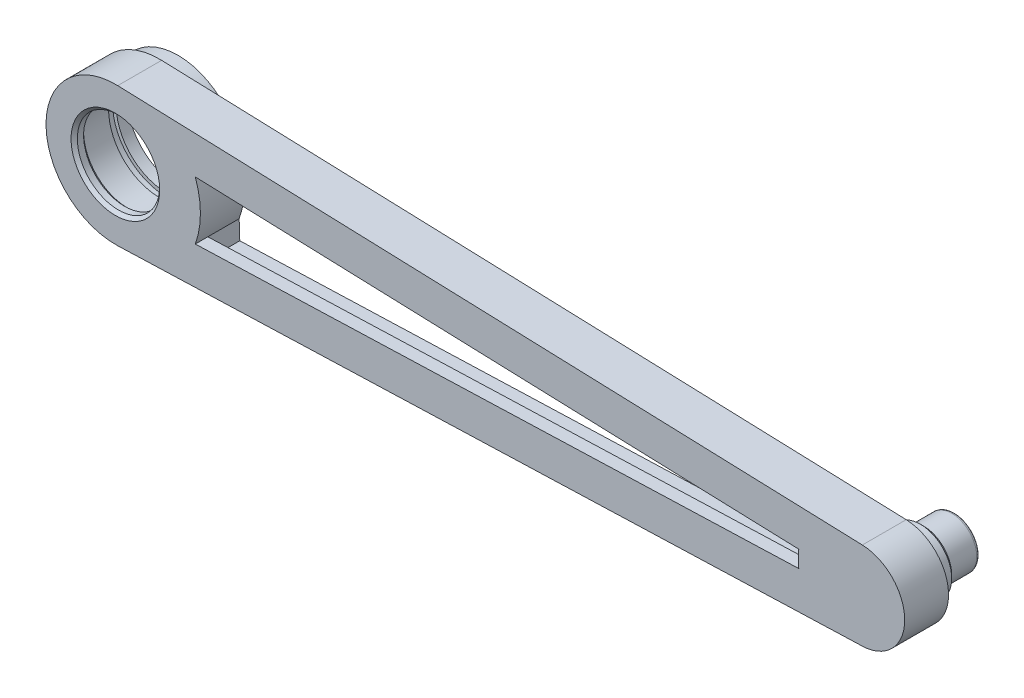
ISO-10303-21;
HEADER;
FILE_DESCRIPTION(('STEP AP214'),'2;1');
FILE_NAME('part.step','',(''),(''),'','','');
FILE_SCHEMA(('AUTOMOTIVE_DESIGN { 1 0 10303 214 1 1 1 1 }'));
ENDSEC;
DATA;
#1=APPLICATION_CONTEXT('core data for automotive mechanical design processes');
#2=APPLICATION_PROTOCOL_DEFINITION('international standard','automotive_design',2000,#1);
#3=PRODUCT_CONTEXT('',#1,'mechanical');
#4=PRODUCT('Part','Part','',(#3));
#5=PRODUCT_RELATED_PRODUCT_CATEGORY('part','',(#4));
#6=PRODUCT_DEFINITION_FORMATION('','',#4);
#7=PRODUCT_DEFINITION_CONTEXT('part definition',#1,'design');
#8=PRODUCT_DEFINITION('design','',#6,#7);
#9=PRODUCT_DEFINITION_SHAPE('','',#8);
#10=(LENGTH_UNIT() NAMED_UNIT(*) SI_UNIT(.MILLI.,.METRE.));
#11=(NAMED_UNIT(*) PLANE_ANGLE_UNIT() SI_UNIT($,.RADIAN.));
#12=(NAMED_UNIT(*) SI_UNIT($,.STERADIAN.) SOLID_ANGLE_UNIT());
#13=UNCERTAINTY_MEASURE_WITH_UNIT(LENGTH_MEASURE(1.E-05),#10,'distance_accuracy_value','');
#14=(GEOMETRIC_REPRESENTATION_CONTEXT(3) GLOBAL_UNCERTAINTY_ASSIGNED_CONTEXT((#13)) GLOBAL_UNIT_ASSIGNED_CONTEXT((#10,
#11,#12)) REPRESENTATION_CONTEXT('',''));
#15=CARTESIAN_POINT('',(0.,0.,0.));
#16=DIRECTION('',(0.,0.,1.));
#17=DIRECTION('',(1.,0.,0.));
#18=AXIS2_PLACEMENT_3D('',#15,#16,#17);
#19=CARTESIAN_POINT('',(0.,0.,7.));
#20=DIRECTION('',(0.,0.,-1.));
#21=DIRECTION('',(-1.,0.,0.));
#22=AXIS2_PLACEMENT_3D('',#19,#20,#21);
#23=CYLINDRICAL_SURFACE('',#22,8.075);
#24=CARTESIAN_POINT('',(0.,0.,-3.));
#25=DIRECTION('',(0.,0.,-1.));
#26=DIRECTION('',(-1.,0.,0.));
#27=AXIS2_PLACEMENT_3D('',#24,#25,#26);
#28=CIRCLE('',#27,8.075);
#29=CARTESIAN_POINT('',(-8.075,0.,-3.));
#30=VERTEX_POINT('',#29);
#31=EDGE_CURVE('E315',#30,#30,#28,.T.);
#32=ORIENTED_EDGE('',*,*,#31,.T.);
#33=EDGE_LOOP('',(#32));
#34=FACE_BOUND('',#33,.T.);
#35=CARTESIAN_POINT('',(0.,0.,-1.2));
#36=DIRECTION('',(0.,0.,1.));
#37=DIRECTION('',(1.,0.,0.));
#38=AXIS2_PLACEMENT_3D('',#35,#36,#37);
#39=CIRCLE('',#38,8.075);
#40=CARTESIAN_POINT('',(8.075,0.,-1.2));
#41=VERTEX_POINT('',#40);
#42=EDGE_CURVE('E51',#41,#41,#39,.T.);
#43=ORIENTED_EDGE('',*,*,#42,.T.);
#44=EDGE_LOOP('',(#43));
#45=FACE_BOUND('',#44,.T.);
#46=ADVANCED_FACE('F50',(#34,#45),#23,.F.);
#47=CARTESIAN_POINT('',(0.,0.,0.));
#48=DIRECTION('',(0.,0.,1.));
#49=DIRECTION('',(1.,0.,0.));
#50=AXIS2_PLACEMENT_3D('',#47,#48,#49);
#51=PLANE('',#50);
#52=DIRECTION('',(0.0342782664469188,-0.99941232754524,0.));
#53=VECTOR('',#52,1.);
#54=CARTESIAN_POINT('',(109.089697810009,-1.33637962534958,0.));
#55=LINE('',#54,#53);
#56=CARTESIAN_POINT('',(109.089697810009,-1.33637962534958,0.));
#57=VERTEX_POINT('',#56);
#58=CARTESIAN_POINT('',(109.192532609349,-4.3346166079853,0.));
#59=VERTEX_POINT('',#58);
#60=EDGE_CURVE('E64',#57,#59,#55,.T.);
#61=ORIENTED_EDGE('',*,*,#60,.F.);
#62=CARTESIAN_POINT('',(119.,0.,0.));
#63=DIRECTION('',(0.,0.,-1.));
#64=DIRECTION('',(-1.,0.,0.));
#65=AXIS2_PLACEMENT_3D('',#62,#63,#64);
#66=CIRCLE('',#65,9.99999999999997);
#67=CARTESIAN_POINT('',(109.090204802286,1.34013400052452,0.));
#68=VERTEX_POINT('',#67);
#69=EDGE_CURVE('E220',#57,#68,#66,.T.);
#70=ORIENTED_EDGE('',*,*,#69,.T.);
#71=DIRECTION('',(-0.0342436974789945,-0.999413512607753,0.));
#72=VECTOR('',#71,1.);
#73=CARTESIAN_POINT('',(109.192935894723,4.33837453834778,0.));
#74=LINE('',#73,#72);
#75=CARTESIAN_POINT('',(109.192935894723,4.33837453834778,0.));
#76=VERTEX_POINT('',#75);
#77=EDGE_CURVE('E199',#76,#68,#74,.T.);
#78=ORIENTED_EDGE('',*,*,#77,.F.);
#79=DIRECTION('',(0.999413512607753,-0.0342436974789916,0.));
#80=VECTOR('',#79,1.);
#81=CARTESIAN_POINT('',(12.8598047369581,7.63911298039967,0.));
#82=LINE('',#81,#80);
#83=CARTESIAN_POINT('',(12.8598047369581,7.63911298039967,0.));
#84=VERTEX_POINT('',#83);
#85=EDGE_CURVE('E201',#84,#76,#82,.T.);
#86=ORIENTED_EDGE('',*,*,#85,.F.);
#87=DIRECTION('',(0.0342436974789916,0.999413512607753,0.));
#88=VECTOR('',#87,1.);
#89=CARTESIAN_POINT('',(12.8598047369581,7.63911298039967,0.));
#90=LINE('',#89,#88);
#91=CARTESIAN_POINT('',(12.7570736445211,4.64087244257641,0.));
#92=VERTEX_POINT('',#91);
#93=EDGE_CURVE('E71',#92,#84,#90,.T.);
#94=ORIENTED_EDGE('',*,*,#93,.F.);
#95=CARTESIAN_POINT('',(0.,0.,0.));
#96=DIRECTION('',(0.,0.,-1.));
#97=DIRECTION('',(-1.,0.,0.));
#98=AXIS2_PLACEMENT_3D('',#95,#96,#97);
#99=CIRCLE('',#98,13.575);
#100=CARTESIAN_POINT('',(12.7572341613009,-4.64043118187699,0.));
#101=VERTEX_POINT('',#100);
#102=EDGE_CURVE('E221',#92,#101,#99,.T.);
#103=ORIENTED_EDGE('',*,*,#102,.T.);
#104=DIRECTION('',(-0.0342782664469217,0.99941232754524,0.));
#105=VECTOR('',#104,1.);
#106=CARTESIAN_POINT('',(12.7572341613009,-4.64043118187699,0.));
#107=LINE('',#106,#105);
#108=CARTESIAN_POINT('',(12.8600689606417,-7.63866816451271,0.));
#109=VERTEX_POINT('',#108);
#110=EDGE_CURVE('E167',#109,#101,#107,.T.);
#111=ORIENTED_EDGE('',*,*,#110,.F.);
#112=DIRECTION('',(-0.99941232754524,-0.034278266446919,0.));
#113=VECTOR('',#112,1.);
#114=CARTESIAN_POINT('',(109.192532609349,-4.3346166079853,0.));
#115=LINE('',#114,#113);
#116=EDGE_CURVE('E175',#59,#109,#115,.T.);
#117=ORIENTED_EDGE('',*,*,#116,.F.);
#118=EDGE_LOOP('',(#61,#70,#78,#86,#94,#103,#111,#117));
#119=FACE_BOUND('',#118,.T.);
#120=DIRECTION('',(0.99941232754524,0.0342782664469186,0.));
#121=VECTOR('',#120,1.);
#122=CARTESIAN_POINT('',(0.379631800899624,-11.0684915275635,0.));
#123=LINE('',#122,#121);
#124=CARTESIAN_POINT('',(0.379631800899624,-11.0684915275635,0.));
#125=VERTEX_POINT('',#124);
#126=CARTESIAN_POINT('',(119.,-7.00000000000001,0.));
#127=VERTEX_POINT('',#126);
#128=EDGE_CURVE('E249',#125,#127,#123,.T.);
#129=ORIENTED_EDGE('',*,*,#128,.F.);
#130=CARTESIAN_POINT('',(0.,0.,0.));
#131=DIRECTION('',(0.,0.,1.));
#132=DIRECTION('',(1.,0.,0.));
#133=AXIS2_PLACEMENT_3D('',#130,#131,#132);
#134=CIRCLE('',#133,11.075);
#135=CARTESIAN_POINT('',(0.379248949579832,11.0685046521309,0.));
#136=VERTEX_POINT('',#135);
#137=EDGE_CURVE('E253',#136,#125,#134,.T.);
#138=ORIENTED_EDGE('',*,*,#137,.F.);
#139=DIRECTION('',(0.999413512607753,-0.0342436974789916,0.));
#140=VECTOR('',#139,1.);
#141=CARTESIAN_POINT('',(0.379248949579832,11.0685046521309,0.));
#142=LINE('',#141,#140);
#143=CARTESIAN_POINT('',(119.239705882353,6.99589458825428,0.));
#144=VERTEX_POINT('',#143);
#145=EDGE_CURVE('E270',#136,#144,#142,.T.);
#146=ORIENTED_EDGE('',*,*,#145,.T.);
#147=CARTESIAN_POINT('',(119.,0.,0.));
#148=DIRECTION('',(0.,0.,1.));
#149=DIRECTION('',(1.,0.,0.));
#150=AXIS2_PLACEMENT_3D('',#147,#148,#149);
#151=CIRCLE('',#150,7.00000000000001);
#152=EDGE_CURVE('E264',#127,#144,#151,.T.);
#153=ORIENTED_EDGE('',*,*,#152,.F.);
#154=EDGE_LOOP('',(#129,#138,#146,#153));
#155=FACE_BOUND('',#154,.T.);
#156=CARTESIAN_POINT('',(119.,0.,0.));
#157=DIRECTION('',(0.,0.,1.));
#158=DIRECTION('',(1.,0.,0.));
#159=AXIS2_PLACEMENT_3D('',#156,#157,#158);
#160=CIRCLE('',#159,5.);
#161=CARTESIAN_POINT('',(124.,0.,0.));
#162=VERTEX_POINT('',#161);
#163=EDGE_CURVE('E283',#162,#162,#160,.F.);
#164=ORIENTED_EDGE('',*,*,#163,.F.);
#165=EDGE_LOOP('',(#164));
#166=FACE_BOUND('',#165,.T.);
#167=CARTESIAN_POINT('',(0.,0.,0.));
#168=DIRECTION('',(0.,0.,1.));
#169=DIRECTION('',(1.,0.,0.));
#170=AXIS2_PLACEMENT_3D('',#167,#168,#169);
#171=CIRCLE('',#170,10.075);
#172=CARTESIAN_POINT('',(10.075,0.,0.));
#173=VERTEX_POINT('',#172);
#174=EDGE_CURVE('E11',#173,#173,#171,.F.);
#175=ORIENTED_EDGE('',*,*,#174,.F.);
#176=EDGE_LOOP('',(#175));
#177=FACE_BOUND('',#176,.T.);
#178=ADVANCED_FACE('F349',(#119,#155,#166,#177),#51,.F.);
#179=CARTESIAN_POINT('',(119.,0.,-10.));
#180=DIRECTION('',(0.,0.,1.));
#181=DIRECTION('',(1.,0.,0.));
#182=AXIS2_PLACEMENT_3D('',#179,#180,#181);
#183=CYLINDRICAL_SURFACE('',#182,4.00000000000001);
#184=CARTESIAN_POINT('',(119.,0.,-7.5));
#185=DIRECTION('',(0.,0.,-1.));
#186=DIRECTION('',(-1.,0.,0.));
#187=AXIS2_PLACEMENT_3D('',#184,#185,#186);
#188=CIRCLE('',#187,4.00000000000001);
#189=CARTESIAN_POINT('',(115.,0.,-7.5));
#190=VERTEX_POINT('',#189);
#191=EDGE_CURVE('E57',#190,#190,#188,.F.);
#192=ORIENTED_EDGE('',*,*,#191,.T.);
#193=EDGE_LOOP('',(#192));
#194=FACE_BOUND('',#193,.T.);
#195=CARTESIAN_POINT('',(119.,0.,-3.));
#196=DIRECTION('',(0.,0.,-1.));
#197=DIRECTION('',(-1.,0.,0.));
#198=AXIS2_PLACEMENT_3D('',#195,#196,#197);
#199=CIRCLE('',#198,4.00000000000001);
#200=CARTESIAN_POINT('',(115.,0.,-3.));
#201=VERTEX_POINT('',#200);
#202=EDGE_CURVE('E222',#201,#201,#199,.T.);
#203=ORIENTED_EDGE('',*,*,#202,.T.);
#204=EDGE_LOOP('',(#203));
#205=FACE_BOUND('',#204,.T.);
#206=ADVANCED_FACE('F360',(#194,#205),#183,.T.);
#207=CARTESIAN_POINT('',(0.173786764705882,5.07202357648435,103.779206215118));
#208=DIRECTION('',(0.0342436974789916,0.999413512607753,0.));
#209=DIRECTION('',(-0.999413512607753,0.0342436974789916,0.));
#210=AXIS2_PLACEMENT_3D('',#207,#208,#209);
#211=PLANE('',#210);
#212=DIRECTION('',(-0.999413512607753,0.0342436974789916,0.));
#213=VECTOR('',#212,1.);
#214=CARTESIAN_POINT('',(12.7570736445211,4.64087244257641,5.));
#215=LINE('',#214,#213);
#216=CARTESIAN_POINT('',(109.090204802286,1.34013400052452,5.));
#217=VERTEX_POINT('',#216);
#218=CARTESIAN_POINT('',(12.7570736445211,4.64087244257641,5.));
#219=VERTEX_POINT('',#218);
#220=EDGE_CURVE('E193',#217,#219,#215,.T.);
#221=ORIENTED_EDGE('',*,*,#220,.F.);
#222=DIRECTION('',(0.,0.,-1.));
#223=VECTOR('',#222,1.);
#224=CARTESIAN_POINT('',(109.090204802286,1.34013400052452,103.779206215118));
#225=LINE('',#224,#223);
#226=CARTESIAN_POINT('',(109.090204802286,1.34013400052452,7.00000000000001));
#227=VERTEX_POINT('',#226);
#228=EDGE_CURVE('E229',#227,#217,#225,.T.);
#229=ORIENTED_EDGE('',*,*,#228,.F.);
#230=DIRECTION('',(0.999413512607753,-0.0342436974789916,0.));
#231=VECTOR('',#230,1.);
#232=CARTESIAN_POINT('',(0.173786764705882,5.07202357648435,7.00000000000001));
#233=LINE('',#232,#231);
#234=CARTESIAN_POINT('',(12.7570736445211,4.64087244257641,7.00000000000001));
#235=VERTEX_POINT('',#234);
#236=EDGE_CURVE('E227',#235,#227,#233,.T.);
#237=ORIENTED_EDGE('',*,*,#236,.F.);
#238=DIRECTION('',(0.,0.,-1.));
#239=VECTOR('',#238,1.);
#240=CARTESIAN_POINT('',(12.7570736445211,4.64087244257641,103.779206215118));
#241=LINE('',#240,#239);
#242=EDGE_CURVE('E228',#235,#219,#241,.T.);
#243=ORIENTED_EDGE('',*,*,#242,.T.);
#244=EDGE_LOOP('',(#221,#229,#237,#243));
#245=FACE_BOUND('',#244,.T.);
#246=ADVANCED_FACE('F374',(#245),#211,.F.);
#247=CARTESIAN_POINT('',(0.173962202218114,-5.07201756229209,103.779206215118));
#248=DIRECTION('',(0.034278266446919,-0.99941232754524,0.));
#249=DIRECTION('',(0.99941232754524,0.034278266446919,0.));
#250=AXIS2_PLACEMENT_3D('',#247,#248,#249);
#251=PLANE('',#250);
#252=DIRECTION('',(0.99941232754524,0.034278266446919,0.));
#253=VECTOR('',#252,1.);
#254=CARTESIAN_POINT('',(109.089697810009,-1.33637962534958,5.));
#255=LINE('',#254,#253);
#256=CARTESIAN_POINT('',(12.7572341613009,-4.64043118187699,5.));
#257=VERTEX_POINT('',#256);
#258=CARTESIAN_POINT('',(109.089697810009,-1.33637962534958,5.));
#259=VERTEX_POINT('',#258);
#260=EDGE_CURVE('E156',#257,#259,#255,.T.);
#261=ORIENTED_EDGE('',*,*,#260,.F.);
#262=DIRECTION('',(0.,0.,-1.));
#263=VECTOR('',#262,1.);
#264=CARTESIAN_POINT('',(12.7572341613009,-4.64043118187699,103.779206215118));
#265=LINE('',#264,#263);
#266=CARTESIAN_POINT('',(12.7572341613009,-4.64043118187699,7.00000000000001));
#267=VERTEX_POINT('',#266);
#268=EDGE_CURVE('E232',#267,#257,#265,.T.);
#269=ORIENTED_EDGE('',*,*,#268,.F.);
#270=DIRECTION('',(-0.99941232754524,-0.034278266446919,0.));
#271=VECTOR('',#270,1.);
#272=CARTESIAN_POINT('',(0.173962202218114,-5.07201756229209,7.00000000000001));
#273=LINE('',#272,#271);
#274=CARTESIAN_POINT('',(109.089697810009,-1.33637962534958,7.00000000000001));
#275=VERTEX_POINT('',#274);
#276=EDGE_CURVE('E219',#275,#267,#273,.T.);
#277=ORIENTED_EDGE('',*,*,#276,.F.);
#278=DIRECTION('',(0.,0.,-1.));
#279=VECTOR('',#278,1.);
#280=CARTESIAN_POINT('',(109.089697810009,-1.33637962534958,103.779206215118));
#281=LINE('',#280,#279);
#282=EDGE_CURVE('E224',#275,#259,#281,.T.);
#283=ORIENTED_EDGE('',*,*,#282,.T.);
#284=EDGE_LOOP('',(#261,#269,#277,#283));
#285=FACE_BOUND('',#284,.T.);
#286=ADVANCED_FACE('F362',(#285),#251,.F.);
#287=CARTESIAN_POINT('',(0.,0.,0.));
#288=DIRECTION('',(0.,0.,1.));
#289=DIRECTION('',(1.,0.,0.));
#290=AXIS2_PLACEMENT_3D('',#287,#288,#289);
#291=CIRCLE('',#290,8.075);
#292=CARTESIAN_POINT('',(8.075,0.,0.));
#293=VERTEX_POINT('',#292);
#294=EDGE_CURVE('E306',#293,#293,#291,.T.);
#295=ORIENTED_EDGE('',*,*,#294,.F.);
#296=EDGE_LOOP('',(#295));
#297=FACE_BOUND('',#296,.T.);
#298=CARTESIAN_POINT('',(0.,0.,5.));
#299=DIRECTION('',(0.,0.,1.));
#300=DIRECTION('',(1.,0.,0.));
#301=AXIS2_PLACEMENT_3D('',#298,#299,#300);
#302=CIRCLE('',#301,8.075);
#303=CARTESIAN_POINT('',(8.075,0.,5.));
#304=VERTEX_POINT('',#303);
#305=EDGE_CURVE('E250',#304,#304,#302,.T.);
#306=ORIENTED_EDGE('',*,*,#305,.T.);
#307=EDGE_LOOP('',(#306));
#308=FACE_BOUND('',#307,.T.);
#309=ADVANCED_FACE('F355',(#297,#308),#23,.F.);
#310=CARTESIAN_POINT('',(0.379631800899624,-11.0684915275635,7.));
#311=DIRECTION('',(-0.0342782664469186,0.99941232754524,0.));
#312=DIRECTION('',(-0.99941232754524,-0.0342782664469186,0.));
#313=AXIS2_PLACEMENT_3D('',#310,#311,#312);
#314=PLANE('',#313);
#315=ORIENTED_EDGE('',*,*,#128,.T.);
#316=DIRECTION('',(0.,0.,-1.));
#317=VECTOR('',#316,1.);
#318=CARTESIAN_POINT('',(119.,-7.00000000000001,7.));
#319=LINE('',#318,#317);
#320=CARTESIAN_POINT('',(119.,-7.00000000000001,7.));
#321=VERTEX_POINT('',#320);
#322=EDGE_CURVE('E276',#321,#127,#319,.T.);
#323=ORIENTED_EDGE('',*,*,#322,.F.);
#324=DIRECTION('',(0.99941232754524,0.0342782664469186,0.));
#325=VECTOR('',#324,1.);
#326=CARTESIAN_POINT('',(0.379631800899624,-11.0684915275635,7.));
#327=LINE('',#326,#325);
#328=CARTESIAN_POINT('',(0.379631800899624,-11.0684915275635,7.));
#329=VERTEX_POINT('',#328);
#330=EDGE_CURVE('E252',#329,#321,#327,.T.);
#331=ORIENTED_EDGE('',*,*,#330,.F.);
#332=DIRECTION('',(0.,0.,-1.));
#333=VECTOR('',#332,1.);
#334=CARTESIAN_POINT('',(0.379631800899624,-11.0684915275635,7.));
#335=LINE('',#334,#333);
#336=EDGE_CURVE('E265',#329,#125,#335,.T.);
#337=ORIENTED_EDGE('',*,*,#336,.T.);
#338=EDGE_LOOP('',(#315,#323,#331,#337));
#339=FACE_BOUND('',#338,.T.);
#340=ADVANCED_FACE('F364',(#339),#314,.F.);
#341=CARTESIAN_POINT('',(119.,0.,7.));
#342=DIRECTION('',(0.,0.,-1.));
#343=DIRECTION('',(-1.,0.,0.));
#344=AXIS2_PLACEMENT_3D('',#341,#342,#343);
#345=CYLINDRICAL_SURFACE('',#344,7.00000000000001);
#346=ORIENTED_EDGE('',*,*,#152,.T.);
#347=DIRECTION('',(0.,0.,-1.));
#348=VECTOR('',#347,1.);
#349=CARTESIAN_POINT('',(119.239705882353,6.99589458825428,7.));
#350=LINE('',#349,#348);
#351=CARTESIAN_POINT('',(119.239705882353,6.99589458825428,7.));
#352=VERTEX_POINT('',#351);
#353=EDGE_CURVE('E278',#352,#144,#350,.T.);
#354=ORIENTED_EDGE('',*,*,#353,.F.);
#355=CARTESIAN_POINT('',(119.,0.,7.));
#356=DIRECTION('',(0.,0.,1.));
#357=DIRECTION('',(1.,0.,0.));
#358=AXIS2_PLACEMENT_3D('',#355,#356,#357);
#359=CIRCLE('',#358,7.00000000000001);
#360=EDGE_CURVE('E251',#321,#352,#359,.T.);
#361=ORIENTED_EDGE('',*,*,#360,.F.);
#362=ORIENTED_EDGE('',*,*,#322,.T.);
#363=EDGE_LOOP('',(#346,#354,#361,#362));
#364=FACE_BOUND('',#363,.T.);
#365=ADVANCED_FACE('F371',(#364),#345,.T.);
#366=CARTESIAN_POINT('',(0.379248949579832,11.0685046521309,7.));
#367=DIRECTION('',(0.0342436974789916,0.999413512607753,0.));
#368=DIRECTION('',(-0.999413512607753,0.0342436974789916,0.));
#369=AXIS2_PLACEMENT_3D('',#366,#367,#368);
#370=PLANE('',#369);
#371=ORIENTED_EDGE('',*,*,#145,.F.);
#372=DIRECTION('',(0.,0.,-1.));
#373=VECTOR('',#372,1.);
#374=CARTESIAN_POINT('',(0.379248949579832,11.0685046521309,7.));
#375=LINE('',#374,#373);
#376=CARTESIAN_POINT('',(0.379248949579832,11.0685046521309,7.));
#377=VERTEX_POINT('',#376);
#378=EDGE_CURVE('E274',#377,#136,#375,.T.);
#379=ORIENTED_EDGE('',*,*,#378,.F.);
#380=DIRECTION('',(0.999413512607753,-0.0342436974789916,0.));
#381=VECTOR('',#380,1.);
#382=CARTESIAN_POINT('',(0.379248949579832,11.0685046521309,7.));
#383=LINE('',#382,#381);
#384=EDGE_CURVE('E260',#377,#352,#383,.T.);
#385=ORIENTED_EDGE('',*,*,#384,.T.);
#386=ORIENTED_EDGE('',*,*,#353,.T.);
#387=EDGE_LOOP('',(#371,#379,#385,#386));
#388=FACE_BOUND('',#387,.T.);
#389=ADVANCED_FACE('F678',(#388),#370,.T.);
#390=CARTESIAN_POINT('',(0.,0.,7.));
#391=DIRECTION('',(0.,0.,-1.));
#392=DIRECTION('',(-1.,0.,0.));
#393=AXIS2_PLACEMENT_3D('',#390,#391,#392);
#394=CYLINDRICAL_SURFACE('',#393,11.075);
#395=ORIENTED_EDGE('',*,*,#137,.T.);
#396=ORIENTED_EDGE('',*,*,#336,.F.);
#397=CARTESIAN_POINT('',(0.,0.,7.));
#398=DIRECTION('',(0.,0.,1.));
#399=DIRECTION('',(1.,0.,0.));
#400=AXIS2_PLACEMENT_3D('',#397,#398,#399);
#401=CIRCLE('',#400,11.075);
#402=EDGE_CURVE('E257',#377,#329,#401,.T.);
#403=ORIENTED_EDGE('',*,*,#402,.F.);
#404=ORIENTED_EDGE('',*,*,#378,.T.);
#405=EDGE_LOOP('',(#395,#396,#403,#404));
#406=FACE_BOUND('',#405,.T.);
#407=ADVANCED_FACE('F394',(#406),#394,.T.);
#408=CARTESIAN_POINT('',(0.,0.,7.));
#409=DIRECTION('',(0.,0.,1.));
#410=DIRECTION('',(1.,0.,0.));
#411=AXIS2_PLACEMENT_3D('',#408,#409,#410);
#412=PLANE('',#411);
#413=ORIENTED_EDGE('',*,*,#236,.T.);
#414=CARTESIAN_POINT('',(119.,0.,7.00000000000001));
#415=DIRECTION('',(0.,0.,1.));
#416=DIRECTION('',(1.,0.,0.));
#417=AXIS2_PLACEMENT_3D('',#414,#415,#416);
#418=CIRCLE('',#417,9.99999999999997);
#419=EDGE_CURVE('E233',#275,#227,#418,.F.);
#420=ORIENTED_EDGE('',*,*,#419,.F.);
#421=ORIENTED_EDGE('',*,*,#276,.T.);
#422=CARTESIAN_POINT('',(0.,0.,7.00000000000001));
#423=DIRECTION('',(0.,0.,1.));
#424=DIRECTION('',(1.,0.,0.));
#425=AXIS2_PLACEMENT_3D('',#422,#423,#424);
#426=CIRCLE('',#425,13.575);
#427=EDGE_CURVE('E183',#235,#267,#426,.F.);
#428=ORIENTED_EDGE('',*,*,#427,.F.);
#429=EDGE_LOOP('',(#413,#420,#421,#428));
#430=FACE_BOUND('',#429,.T.);
#431=CARTESIAN_POINT('',(0.,0.,7.));
#432=DIRECTION('',(0.,0.,1.));
#433=DIRECTION('',(1.,0.,0.));
#434=AXIS2_PLACEMENT_3D('',#431,#432,#433);
#435=CIRCLE('',#434,7.07500000000001);
#436=CARTESIAN_POINT('',(7.07500000000001,0.,7.));
#437=VERTEX_POINT('',#436);
#438=EDGE_CURVE('E287',#437,#437,#435,.F.);
#439=ORIENTED_EDGE('',*,*,#438,.T.);
#440=EDGE_LOOP('',(#439));
#441=FACE_BOUND('',#440,.T.);
#442=ORIENTED_EDGE('',*,*,#330,.T.);
#443=ORIENTED_EDGE('',*,*,#360,.T.);
#444=ORIENTED_EDGE('',*,*,#384,.F.);
#445=ORIENTED_EDGE('',*,*,#402,.T.);
#446=EDGE_LOOP('',(#442,#443,#444,#445));
#447=FACE_BOUND('',#446,.T.);
#448=ADVANCED_FACE('F381',(#430,#441,#447),#412,.T.);
#449=CARTESIAN_POINT('',(0.,0.,5.));
#450=DIRECTION('',(0.,0.,1.));
#451=DIRECTION('',(1.,0.,0.));
#452=AXIS2_PLACEMENT_3D('',#449,#450,#451);
#453=PLANE('',#452);
#454=CARTESIAN_POINT('',(0.,0.,5.));
#455=DIRECTION('',(0.,0.,1.));
#456=DIRECTION('',(1.,0.,0.));
#457=AXIS2_PLACEMENT_3D('',#454,#455,#456);
#458=CIRCLE('',#457,7.07500000000001);
#459=CARTESIAN_POINT('',(7.07500000000001,0.,5.));
#460=VERTEX_POINT('',#459);
#461=EDGE_CURVE('E291',#460,#460,#458,.T.);
#462=ORIENTED_EDGE('',*,*,#461,.T.);
#463=EDGE_LOOP('',(#462));
#464=FACE_BOUND('',#463,.T.);
#465=ORIENTED_EDGE('',*,*,#305,.F.);
#466=EDGE_LOOP('',(#465));
#467=FACE_BOUND('',#466,.T.);
#468=ADVANCED_FACE('F382',(#464,#467),#453,.F.);
#469=CARTESIAN_POINT('',(0.,0.,5.));
#470=DIRECTION('',(0.,0.,1.));
#471=DIRECTION('',(1.,0.,0.));
#472=AXIS2_PLACEMENT_3D('',#469,#470,#471);
#473=CYLINDRICAL_SURFACE('',#472,6.575);
#474=CARTESIAN_POINT('',(0.,0.,6.49999999999998));
#475=DIRECTION('',(0.,0.,1.));
#476=DIRECTION('',(1.,0.,0.));
#477=AXIS2_PLACEMENT_3D('',#474,#475,#476);
#478=CIRCLE('',#477,6.575);
#479=CARTESIAN_POINT('',(6.575,0.,6.49999999999998));
#480=VERTEX_POINT('',#479);
#481=EDGE_CURVE('E286',#480,#480,#478,.T.);
#482=ORIENTED_EDGE('',*,*,#481,.T.);
#483=EDGE_LOOP('',(#482));
#484=FACE_BOUND('',#483,.T.);
#485=CARTESIAN_POINT('',(0.,0.,5.50000000000002));
#486=DIRECTION('',(0.,0.,1.));
#487=DIRECTION('',(1.,0.,0.));
#488=AXIS2_PLACEMENT_3D('',#485,#486,#487);
#489=CIRCLE('',#488,6.575);
#490=CARTESIAN_POINT('',(6.575,0.,5.50000000000002));
#491=VERTEX_POINT('',#490);
#492=EDGE_CURVE('E282',#491,#491,#489,.F.);
#493=ORIENTED_EDGE('',*,*,#492,.T.);
#494=EDGE_LOOP('',(#493));
#495=FACE_BOUND('',#494,.T.);
#496=ADVANCED_FACE('F384',(#484,#495),#473,.F.);
#497=CARTESIAN_POINT('',(119.,0.,-3.));
#498=DIRECTION('',(0.,0.,-1.));
#499=DIRECTION('',(-1.,0.,0.));
#500=AXIS2_PLACEMENT_3D('',#497,#498,#499);
#501=PLANE('',#500);
#502=CARTESIAN_POINT('',(119.,0.,-3.));
#503=DIRECTION('',(0.,0.,-1.));
#504=DIRECTION('',(-1.,0.,0.));
#505=AXIS2_PLACEMENT_3D('',#502,#503,#504);
#506=CIRCLE('',#505,4.5);
#507=CARTESIAN_POINT('',(114.5,0.,-3.));
#508=VERTEX_POINT('',#507);
#509=EDGE_CURVE('E298',#508,#508,#506,.T.);
#510=ORIENTED_EDGE('',*,*,#509,.T.);
#511=EDGE_LOOP('',(#510));
#512=FACE_BOUND('',#511,.T.);
#513=ORIENTED_EDGE('',*,*,#202,.F.);
#514=EDGE_LOOP('',(#513));
#515=FACE_BOUND('',#514,.T.);
#516=ADVANCED_FACE('F393',(#512,#515),#501,.T.);
#517=CARTESIAN_POINT('',(119.,0.,-3.));
#518=DIRECTION('',(0.,0.,1.));
#519=DIRECTION('',(1.,0.,0.));
#520=AXIS2_PLACEMENT_3D('',#517,#518,#519);
#521=CYLINDRICAL_SURFACE('',#520,5.);
#522=CARTESIAN_POINT('',(119.,0.,-2.50000000000002));
#523=DIRECTION('',(0.,0.,-1.));
#524=DIRECTION('',(-1.,0.,0.));
#525=AXIS2_PLACEMENT_3D('',#522,#523,#524);
#526=CIRCLE('',#525,5.);
#527=CARTESIAN_POINT('',(114.,0.,-2.50000000000002));
#528=VERTEX_POINT('',#527);
#529=EDGE_CURVE('E299',#528,#528,#526,.F.);
#530=ORIENTED_EDGE('',*,*,#529,.T.);
#531=EDGE_LOOP('',(#530));
#532=FACE_BOUND('',#531,.T.);
#533=ORIENTED_EDGE('',*,*,#163,.T.);
#534=EDGE_LOOP('',(#533));
#535=FACE_BOUND('',#534,.T.);
#536=ADVANCED_FACE('F402',(#532,#535),#521,.T.);
#537=CARTESIAN_POINT('',(0.,0.,6.49999999999998));
#538=DIRECTION('',(0.,0.,1.));
#539=DIRECTION('',(1.,0.,0.));
#540=AXIS2_PLACEMENT_3D('',#537,#538,#539);
#541=CONICAL_SURFACE('',#540,6.575,0.78539816339744);
#542=ORIENTED_EDGE('',*,*,#438,.F.);
#543=EDGE_LOOP('',(#542));
#544=FACE_BOUND('',#543,.T.);
#545=ORIENTED_EDGE('',*,*,#481,.F.);
#546=EDGE_LOOP('',(#545));
#547=FACE_BOUND('',#546,.T.);
#548=ADVANCED_FACE('F404',(#544,#547),#541,.F.);
#549=CARTESIAN_POINT('',(0.,0.,5.));
#550=DIRECTION('',(0.,0.,-1.));
#551=DIRECTION('',(-1.,0.,0.));
#552=AXIS2_PLACEMENT_3D('',#549,#550,#551);
#553=CONICAL_SURFACE('',#552,7.07500000000001,0.785398163397444);
#554=ORIENTED_EDGE('',*,*,#492,.F.);
#555=EDGE_LOOP('',(#554));
#556=FACE_BOUND('',#555,.T.);
#557=ORIENTED_EDGE('',*,*,#461,.F.);
#558=EDGE_LOOP('',(#557));
#559=FACE_BOUND('',#558,.T.);
#560=ADVANCED_FACE('F611',(#556,#559),#553,.F.);
#561=CARTESIAN_POINT('',(119.,0.,-3.));
#562=DIRECTION('',(0.,0.,1.));
#563=DIRECTION('',(1.,0.,0.));
#564=AXIS2_PLACEMENT_3D('',#561,#562,#563);
#565=CONICAL_SURFACE('',#564,4.5,0.785398163397466);
#566=ORIENTED_EDGE('',*,*,#529,.F.);
#567=EDGE_LOOP('',(#566));
#568=FACE_BOUND('',#567,.T.);
#569=ORIENTED_EDGE('',*,*,#509,.F.);
#570=EDGE_LOOP('',(#569));
#571=FACE_BOUND('',#570,.T.);
#572=ADVANCED_FACE('F414',(#568,#571),#565,.T.);
#573=CARTESIAN_POINT('',(119.,0.,103.779206215118));
#574=DIRECTION('',(0.,0.,-1.));
#575=DIRECTION('',(-1.,0.,0.));
#576=AXIS2_PLACEMENT_3D('',#573,#574,#575);
#577=CYLINDRICAL_SURFACE('',#576,9.99999999999997);
#578=ORIENTED_EDGE('',*,*,#419,.T.);
#579=ORIENTED_EDGE('',*,*,#228,.T.);
#580=DIRECTION('',(0.,0.,-1.));
#581=VECTOR('',#580,1.);
#582=CARTESIAN_POINT('',(109.090204802286,1.34013400052452,5.));
#583=LINE('',#582,#581);
#584=EDGE_CURVE('E194',#217,#68,#583,.T.);
#585=ORIENTED_EDGE('',*,*,#584,.T.);
#586=ORIENTED_EDGE('',*,*,#69,.F.);
#587=DIRECTION('',(0.,0.,-1.));
#588=VECTOR('',#587,1.);
#589=CARTESIAN_POINT('',(109.089697810009,-1.33637962534958,5.));
#590=LINE('',#589,#588);
#591=EDGE_CURVE('E185',#259,#57,#590,.T.);
#592=ORIENTED_EDGE('',*,*,#591,.F.);
#593=ORIENTED_EDGE('',*,*,#282,.F.);
#594=EDGE_LOOP('',(#578,#579,#585,#586,#592,#593));
#595=FACE_BOUND('',#594,.T.);
#596=ADVANCED_FACE('F415',(#595),#577,.T.);
#597=CARTESIAN_POINT('',(0.,0.,103.779206215118));
#598=DIRECTION('',(0.,0.,-1.));
#599=DIRECTION('',(-1.,0.,0.));
#600=AXIS2_PLACEMENT_3D('',#597,#598,#599);
#601=CYLINDRICAL_SURFACE('',#600,13.575);
#602=ORIENTED_EDGE('',*,*,#427,.T.);
#603=ORIENTED_EDGE('',*,*,#268,.T.);
#604=DIRECTION('',(0.,0.,-1.));
#605=VECTOR('',#604,1.);
#606=CARTESIAN_POINT('',(12.7572341613009,-4.64043118187699,5.));
#607=LINE('',#606,#605);
#608=EDGE_CURVE('E184',#257,#101,#607,.T.);
#609=ORIENTED_EDGE('',*,*,#608,.T.);
#610=ORIENTED_EDGE('',*,*,#102,.F.);
#611=DIRECTION('',(0.,0.,-1.));
#612=VECTOR('',#611,1.);
#613=CARTESIAN_POINT('',(12.7570736445211,4.64087244257641,5.));
#614=LINE('',#613,#612);
#615=EDGE_CURVE('E200',#219,#92,#614,.T.);
#616=ORIENTED_EDGE('',*,*,#615,.F.);
#617=ORIENTED_EDGE('',*,*,#242,.F.);
#618=EDGE_LOOP('',(#602,#603,#609,#610,#616,#617));
#619=FACE_BOUND('',#618,.T.);
#620=ADVANCED_FACE('F412',(#619),#601,.T.);
#621=CARTESIAN_POINT('',(12.8598047369581,7.63911298039967,5.));
#622=DIRECTION('',(-0.999413512607753,0.0342436974789916,0.));
#623=DIRECTION('',(-0.0342436974789916,-0.999413512607753,0.));
#624=AXIS2_PLACEMENT_3D('',#621,#622,#623);
#625=PLANE('',#624);
#626=ORIENTED_EDGE('',*,*,#93,.T.);
#627=DIRECTION('',(0.,0.,-1.));
#628=VECTOR('',#627,1.);
#629=CARTESIAN_POINT('',(12.8598047369581,7.63911298039967,5.));
#630=LINE('',#629,#628);
#631=CARTESIAN_POINT('',(12.8598047369581,7.63911298039967,5.));
#632=VERTEX_POINT('',#631);
#633=EDGE_CURVE('E186',#632,#84,#630,.T.);
#634=ORIENTED_EDGE('',*,*,#633,.F.);
#635=DIRECTION('',(0.0342436974789916,0.999413512607753,0.));
#636=VECTOR('',#635,1.);
#637=CARTESIAN_POINT('',(12.8598047369581,7.63911298039967,5.));
#638=LINE('',#637,#636);
#639=EDGE_CURVE('E205',#219,#632,#638,.T.);
#640=ORIENTED_EDGE('',*,*,#639,.F.);
#641=ORIENTED_EDGE('',*,*,#615,.T.);
#642=EDGE_LOOP('',(#626,#634,#640,#641));
#643=FACE_BOUND('',#642,.T.);
#644=ADVANCED_FACE('F417',(#643),#625,.F.);
#645=CARTESIAN_POINT('',(109.192935894723,4.33837453834778,5.));
#646=DIRECTION('',(0.999413512607753,-0.0342436974789945,0.));
#647=DIRECTION('',(0.0342436974789945,0.999413512607753,0.));
#648=AXIS2_PLACEMENT_3D('',#645,#646,#647);
#649=PLANE('',#648);
#650=ORIENTED_EDGE('',*,*,#77,.T.);
#651=ORIENTED_EDGE('',*,*,#584,.F.);
#652=DIRECTION('',(-0.0342436974789945,-0.999413512607753,0.));
#653=VECTOR('',#652,1.);
#654=CARTESIAN_POINT('',(109.192935894723,4.33837453834778,5.));
#655=LINE('',#654,#653);
#656=CARTESIAN_POINT('',(109.192935894723,4.33837453834778,5.));
#657=VERTEX_POINT('',#656);
#658=EDGE_CURVE('E209',#657,#217,#655,.T.);
#659=ORIENTED_EDGE('',*,*,#658,.F.);
#660=DIRECTION('',(0.,0.,-1.));
#661=VECTOR('',#660,1.);
#662=CARTESIAN_POINT('',(109.192935894723,4.33837453834778,5.));
#663=LINE('',#662,#661);
#664=EDGE_CURVE('E195',#657,#76,#663,.T.);
#665=ORIENTED_EDGE('',*,*,#664,.T.);
#666=EDGE_LOOP('',(#650,#651,#659,#665));
#667=FACE_BOUND('',#666,.T.);
#668=ADVANCED_FACE('F430',(#667),#649,.F.);
#669=CARTESIAN_POINT('',(12.8598047369581,7.63911298039967,5.));
#670=DIRECTION('',(0.0342436974789916,0.999413512607753,0.));
#671=DIRECTION('',(-0.999413512607753,0.0342436974789916,0.));
#672=AXIS2_PLACEMENT_3D('',#669,#670,#671);
#673=PLANE('',#672);
#674=ORIENTED_EDGE('',*,*,#85,.T.);
#675=ORIENTED_EDGE('',*,*,#664,.F.);
#676=DIRECTION('',(0.999413512607753,-0.0342436974789916,0.));
#677=VECTOR('',#676,1.);
#678=CARTESIAN_POINT('',(12.8598047369581,7.63911298039967,5.));
#679=LINE('',#678,#677);
#680=EDGE_CURVE('E215',#632,#657,#679,.T.);
#681=ORIENTED_EDGE('',*,*,#680,.F.);
#682=ORIENTED_EDGE('',*,*,#633,.T.);
#683=EDGE_LOOP('',(#674,#675,#681,#682));
#684=FACE_BOUND('',#683,.T.);
#685=ADVANCED_FACE('F424',(#684),#673,.F.);
#686=CARTESIAN_POINT('',(0.,0.,5.));
#687=DIRECTION('',(0.,0.,1.));
#688=DIRECTION('',(1.,0.,0.));
#689=AXIS2_PLACEMENT_3D('',#686,#687,#688);
#690=PLANE('',#689);
#691=ORIENTED_EDGE('',*,*,#639,.T.);
#692=ORIENTED_EDGE('',*,*,#680,.T.);
#693=ORIENTED_EDGE('',*,*,#658,.T.);
#694=ORIENTED_EDGE('',*,*,#220,.T.);
#695=EDGE_LOOP('',(#691,#692,#693,#694));
#696=FACE_BOUND('',#695,.T.);
#697=ADVANCED_FACE('F422',(#696),#690,.F.);
#698=CARTESIAN_POINT('',(109.089697810009,-1.33637962534958,5.));
#699=DIRECTION('',(0.99941232754524,0.0342782664469188,0.));
#700=DIRECTION('',(-0.0342782664469188,0.99941232754524,0.));
#701=AXIS2_PLACEMENT_3D('',#698,#699,#700);
#702=PLANE('',#701);
#703=ORIENTED_EDGE('',*,*,#60,.T.);
#704=DIRECTION('',(0.,0.,-1.));
#705=VECTOR('',#704,1.);
#706=CARTESIAN_POINT('',(109.192532609349,-4.3346166079853,5.));
#707=LINE('',#706,#705);
#708=CARTESIAN_POINT('',(109.192532609349,-4.3346166079853,5.));
#709=VERTEX_POINT('',#708);
#710=EDGE_CURVE('E150',#709,#59,#707,.T.);
#711=ORIENTED_EDGE('',*,*,#710,.F.);
#712=DIRECTION('',(0.0342782664469188,-0.99941232754524,0.));
#713=VECTOR('',#712,1.);
#714=CARTESIAN_POINT('',(109.089697810009,-1.33637962534958,5.));
#715=LINE('',#714,#713);
#716=EDGE_CURVE('E153',#259,#709,#715,.T.);
#717=ORIENTED_EDGE('',*,*,#716,.F.);
#718=ORIENTED_EDGE('',*,*,#591,.T.);
#719=EDGE_LOOP('',(#703,#711,#717,#718));
#720=FACE_BOUND('',#719,.T.);
#721=ADVANCED_FACE('F149',(#720),#702,.F.);
#722=CARTESIAN_POINT('',(12.7572341613009,-4.64043118187699,5.));
#723=DIRECTION('',(-0.99941232754524,-0.0342782664469217,0.));
#724=DIRECTION('',(0.0342782664469217,-0.99941232754524,0.));
#725=AXIS2_PLACEMENT_3D('',#722,#723,#724);
#726=PLANE('',#725);
#727=ORIENTED_EDGE('',*,*,#110,.T.);
#728=ORIENTED_EDGE('',*,*,#608,.F.);
#729=DIRECTION('',(-0.0342782664469217,0.99941232754524,0.));
#730=VECTOR('',#729,1.);
#731=CARTESIAN_POINT('',(12.7572341613009,-4.64043118187699,5.));
#732=LINE('',#731,#730);
#733=CARTESIAN_POINT('',(12.8600689606417,-7.63866816451271,5.));
#734=VERTEX_POINT('',#733);
#735=EDGE_CURVE('E164',#734,#257,#732,.T.);
#736=ORIENTED_EDGE('',*,*,#735,.F.);
#737=DIRECTION('',(0.,0.,-1.));
#738=VECTOR('',#737,1.);
#739=CARTESIAN_POINT('',(12.8600689606417,-7.63866816451271,5.));
#740=LINE('',#739,#738);
#741=EDGE_CURVE('E159',#734,#109,#740,.T.);
#742=ORIENTED_EDGE('',*,*,#741,.T.);
#743=EDGE_LOOP('',(#727,#728,#736,#742));
#744=FACE_BOUND('',#743,.T.);
#745=ADVANCED_FACE('F438',(#744),#726,.F.);
#746=CARTESIAN_POINT('',(109.192532609349,-4.3346166079853,5.));
#747=DIRECTION('',(0.034278266446919,-0.99941232754524,0.));
#748=DIRECTION('',(0.99941232754524,0.034278266446919,0.));
#749=AXIS2_PLACEMENT_3D('',#746,#747,#748);
#750=PLANE('',#749);
#751=ORIENTED_EDGE('',*,*,#116,.T.);
#752=ORIENTED_EDGE('',*,*,#741,.F.);
#753=DIRECTION('',(-0.99941232754524,-0.034278266446919,0.));
#754=VECTOR('',#753,1.);
#755=CARTESIAN_POINT('',(109.192532609349,-4.3346166079853,5.));
#756=LINE('',#755,#754);
#757=EDGE_CURVE('E157',#709,#734,#756,.T.);
#758=ORIENTED_EDGE('',*,*,#757,.F.);
#759=ORIENTED_EDGE('',*,*,#710,.T.);
#760=EDGE_LOOP('',(#751,#752,#758,#759));
#761=FACE_BOUND('',#760,.T.);
#762=ADVANCED_FACE('F163',(#761),#750,.F.);
#763=CARTESIAN_POINT('',(0.,0.,5.));
#764=DIRECTION('',(0.,0.,-1.));
#765=DIRECTION('',(-1.,0.,0.));
#766=AXIS2_PLACEMENT_3D('',#763,#764,#765);
#767=PLANE('',#766);
#768=ORIENTED_EDGE('',*,*,#716,.T.);
#769=ORIENTED_EDGE('',*,*,#757,.T.);
#770=ORIENTED_EDGE('',*,*,#735,.T.);
#771=ORIENTED_EDGE('',*,*,#260,.T.);
#772=EDGE_LOOP('',(#768,#769,#770,#771));
#773=FACE_BOUND('',#772,.T.);
#774=ADVANCED_FACE('F170',(#773),#767,.T.);
#775=CARTESIAN_POINT('',(119.,0.,-8.));
#776=DIRECTION('',(0.,0.,-1.));
#777=DIRECTION('',(-1.,0.,0.));
#778=AXIS2_PLACEMENT_3D('',#775,#776,#777);
#779=PLANE('',#778);
#780=CARTESIAN_POINT('',(119.,0.,-8.));
#781=DIRECTION('',(0.,0.,-1.));
#782=DIRECTION('',(-1.,0.,0.));
#783=AXIS2_PLACEMENT_3D('',#780,#781,#782);
#784=CIRCLE('',#783,2.2);
#785=CARTESIAN_POINT('',(116.8,0.,-8.));
#786=VERTEX_POINT('',#785);
#787=EDGE_CURVE('E174',#786,#786,#784,.T.);
#788=ORIENTED_EDGE('',*,*,#787,.F.);
#789=EDGE_LOOP('',(#788));
#790=FACE_BOUND('',#789,.T.);
#791=CARTESIAN_POINT('',(119.,0.,-8.));
#792=DIRECTION('',(0.,0.,-1.));
#793=DIRECTION('',(-1.,0.,0.));
#794=AXIS2_PLACEMENT_3D('',#791,#792,#793);
#795=CIRCLE('',#794,3.50000000000001);
#796=CARTESIAN_POINT('',(115.5,0.,-8.));
#797=VERTEX_POINT('',#796);
#798=EDGE_CURVE('E305',#797,#797,#795,.T.);
#799=ORIENTED_EDGE('',*,*,#798,.T.);
#800=EDGE_LOOP('',(#799));
#801=FACE_BOUND('',#800,.T.);
#802=ADVANCED_FACE('F335',(#790,#801),#779,.T.);
#803=CARTESIAN_POINT('',(119.,0.,-7.5));
#804=DIRECTION('',(0.,0.,-1.));
#805=DIRECTION('',(-1.,0.,0.));
#806=AXIS2_PLACEMENT_3D('',#803,#804,#805);
#807=TOROIDAL_SURFACE('',#806,3.50000000000001,0.5);
#808=ORIENTED_EDGE('',*,*,#191,.F.);
#809=EDGE_LOOP('',(#808));
#810=FACE_BOUND('',#809,.T.);
#811=ORIENTED_EDGE('',*,*,#798,.F.);
#812=EDGE_LOOP('',(#811));
#813=FACE_BOUND('',#812,.T.);
#814=ADVANCED_FACE('F47',(#810,#813),#807,.T.);
#815=CARTESIAN_POINT('',(119.,0.,2.));
#816=DIRECTION('',(0.,0.,-1.));
#817=DIRECTION('',(-1.,0.,0.));
#818=AXIS2_PLACEMENT_3D('',#815,#816,#817);
#819=CYLINDRICAL_SURFACE('',#818,2.2);
#820=CARTESIAN_POINT('',(119.,0.,2.));
#821=DIRECTION('',(0.,0.,-1.));
#822=DIRECTION('',(-1.,0.,0.));
#823=AXIS2_PLACEMENT_3D('',#820,#821,#822);
#824=CIRCLE('',#823,2.2);
#825=CARTESIAN_POINT('',(116.8,0.,2.));
#826=VERTEX_POINT('',#825);
#827=EDGE_CURVE('E197',#826,#826,#824,.T.);
#828=ORIENTED_EDGE('',*,*,#827,.F.);
#829=EDGE_LOOP('',(#828));
#830=FACE_BOUND('',#829,.T.);
#831=ORIENTED_EDGE('',*,*,#787,.T.);
#832=EDGE_LOOP('',(#831));
#833=FACE_BOUND('',#832,.T.);
#834=ADVANCED_FACE('F334',(#830,#833),#819,.F.);
#835=CARTESIAN_POINT('',(119.,0.,2.));
#836=DIRECTION('',(0.,0.,-1.));
#837=DIRECTION('',(-1.,0.,0.));
#838=AXIS2_PLACEMENT_3D('',#835,#836,#837);
#839=PLANE('',#838);
#840=ORIENTED_EDGE('',*,*,#827,.T.);
#841=EDGE_LOOP('',(#840));
#842=FACE_BOUND('',#841,.T.);
#843=ADVANCED_FACE('F342',(#842),#839,.T.);
#844=CARTESIAN_POINT('',(0.,0.,-3.));
#845=DIRECTION('',(0.,0.,-1.));
#846=DIRECTION('',(-1.,0.,0.));
#847=AXIS2_PLACEMENT_3D('',#844,#845,#846);
#848=PLANE('',#847);
#849=CARTESIAN_POINT('',(0.,0.,-3.));
#850=DIRECTION('',(0.,0.,-1.));
#851=DIRECTION('',(-1.,0.,0.));
#852=AXIS2_PLACEMENT_3D('',#849,#850,#851);
#853=CIRCLE('',#852,10.075);
#854=CARTESIAN_POINT('',(-10.075,0.,-3.));
#855=VERTEX_POINT('',#854);
#856=EDGE_CURVE('E321',#855,#855,#853,.T.);
#857=ORIENTED_EDGE('',*,*,#856,.T.);
#858=EDGE_LOOP('',(#857));
#859=FACE_BOUND('',#858,.T.);
#860=ORIENTED_EDGE('',*,*,#31,.F.);
#861=EDGE_LOOP('',(#860));
#862=FACE_BOUND('',#861,.T.);
#863=ADVANCED_FACE('F449',(#859,#862),#848,.T.);
#864=CARTESIAN_POINT('',(0.,0.,-3.));
#865=DIRECTION('',(0.,0.,1.));
#866=DIRECTION('',(1.,0.,0.));
#867=AXIS2_PLACEMENT_3D('',#864,#865,#866);
#868=CYLINDRICAL_SURFACE('',#867,10.075);
#869=ORIENTED_EDGE('',*,*,#856,.F.);
#870=EDGE_LOOP('',(#869));
#871=FACE_BOUND('',#870,.T.);
#872=ORIENTED_EDGE('',*,*,#174,.T.);
#873=EDGE_LOOP('',(#872));
#874=FACE_BOUND('',#873,.T.);
#875=ADVANCED_FACE('F446',(#871,#874),#868,.T.);
#876=CARTESIAN_POINT('',(0.,0.,0.));
#877=DIRECTION('',(0.,0.,1.));
#878=DIRECTION('',(1.,0.,0.));
#879=AXIS2_PLACEMENT_3D('',#876,#877,#878);
#880=CYLINDRICAL_SURFACE('',#879,8.65);
#881=CARTESIAN_POINT('',(0.,0.,0.));
#882=DIRECTION('',(0.,0.,1.));
#883=DIRECTION('',(1.,0.,0.));
#884=AXIS2_PLACEMENT_3D('',#881,#882,#883);
#885=CIRCLE('',#884,8.65);
#886=CARTESIAN_POINT('',(8.65,0.,0.));
#887=VERTEX_POINT('',#886);
#888=EDGE_CURVE('E313',#887,#887,#885,.T.);
#889=ORIENTED_EDGE('',*,*,#888,.T.);
#890=EDGE_LOOP('',(#889));
#891=FACE_BOUND('',#890,.T.);
#892=CARTESIAN_POINT('',(0.,0.,-1.2));
#893=DIRECTION('',(0.,0.,1.));
#894=DIRECTION('',(1.,0.,0.));
#895=AXIS2_PLACEMENT_3D('',#892,#893,#894);
#896=CIRCLE('',#895,8.65);
#897=CARTESIAN_POINT('',(8.65,0.,-1.2));
#898=VERTEX_POINT('',#897);
#899=EDGE_CURVE('E308',#898,#898,#896,.T.);
#900=ORIENTED_EDGE('',*,*,#899,.F.);
#901=EDGE_LOOP('',(#900));
#902=FACE_BOUND('',#901,.T.);
#903=ADVANCED_FACE('F453',(#891,#902),#880,.F.);
#904=CARTESIAN_POINT('',(0.,0.,-1.2));
#905=DIRECTION('',(0.,0.,1.));
#906=DIRECTION('',(1.,0.,0.));
#907=AXIS2_PLACEMENT_3D('',#904,#905,#906);
#908=PLANE('',#907);
#909=ORIENTED_EDGE('',*,*,#42,.F.);
#910=EDGE_LOOP('',(#909));
#911=FACE_BOUND('',#910,.T.);
#912=ORIENTED_EDGE('',*,*,#899,.T.);
#913=EDGE_LOOP('',(#912));
#914=FACE_BOUND('',#913,.T.);
#915=ADVANCED_FACE('F460',(#911,#914),#908,.T.);
#916=CARTESIAN_POINT('',(0.,0.,0.));
#917=DIRECTION('',(0.,0.,1.));
#918=DIRECTION('',(1.,0.,0.));
#919=AXIS2_PLACEMENT_3D('',#916,#917,#918);
#920=PLANE('',#919);
#921=ORIENTED_EDGE('',*,*,#294,.T.);
#922=EDGE_LOOP('',(#921));
#923=FACE_BOUND('',#922,.T.);
#924=ORIENTED_EDGE('',*,*,#888,.F.);
#925=EDGE_LOOP('',(#924));
#926=FACE_BOUND('',#925,.T.);
#927=ADVANCED_FACE('F464',(#923,#926),#920,.F.);
#928=CLOSED_SHELL('',(#46,#178,#206,#246,#286,#309,#340,#365,#389,#407,#448,#468,#496,#516,#536,
#548,#560,#572,#596,#620,#644,#668,#685,#697,#721,#745,#762,#774,#802,#814,#834,#843,#863,#875,
#903,#915,#927));
#929=MANIFOLD_SOLID_BREP('B2',#928);
#930=ADVANCED_BREP_SHAPE_REPRESENTATION('',(#18,#929),#14);
#931=SHAPE_DEFINITION_REPRESENTATION(#9,#930);
ENDSEC;
END-ISO-10303-21;
